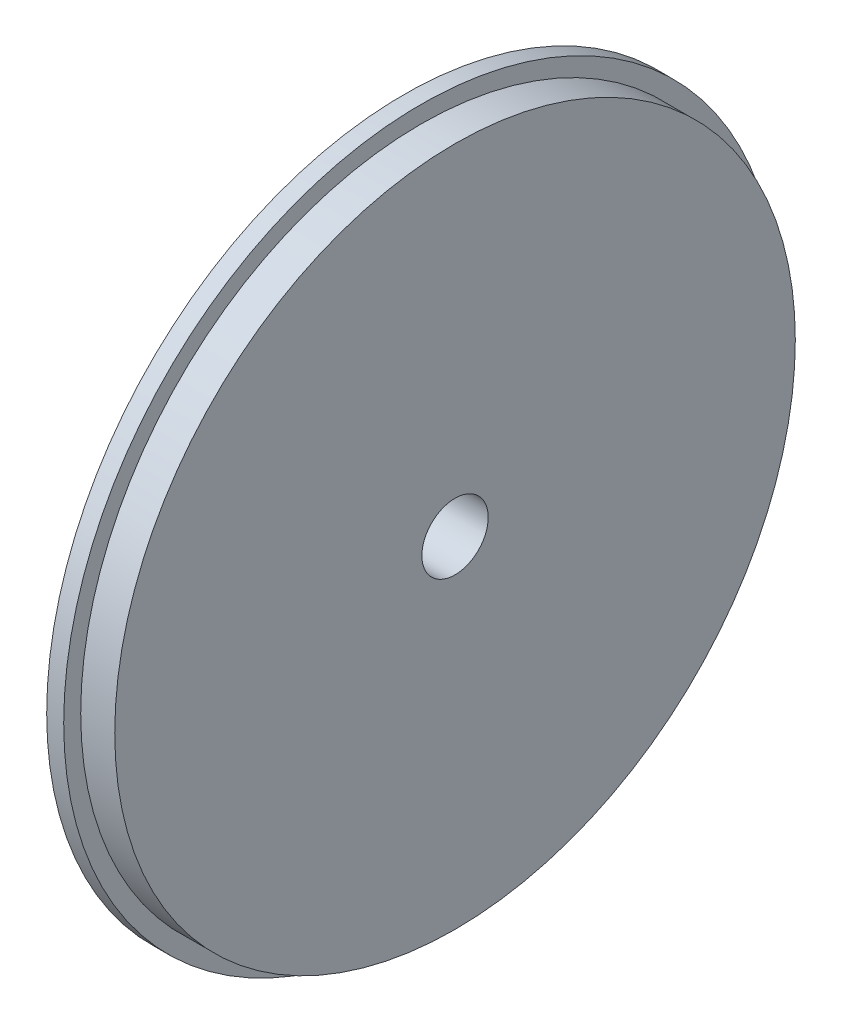
ISO-10303-21;
HEADER;
FILE_DESCRIPTION(('STEP AP214'),'2;1');
FILE_NAME('part.step','',(''),(''),'','','');
FILE_SCHEMA(('AUTOMOTIVE_DESIGN { 1 0 10303 214 1 1 1 1 }'));
ENDSEC;
DATA;
#1=APPLICATION_CONTEXT('core data for automotive mechanical design processes');
#2=APPLICATION_PROTOCOL_DEFINITION('international standard','automotive_design',2000,#1);
#3=PRODUCT_CONTEXT('',#1,'mechanical');
#4=PRODUCT('Part','Part','',(#3));
#5=PRODUCT_RELATED_PRODUCT_CATEGORY('part','',(#4));
#6=PRODUCT_DEFINITION_FORMATION('','',#4);
#7=PRODUCT_DEFINITION_CONTEXT('part definition',#1,'design');
#8=PRODUCT_DEFINITION('design','',#6,#7);
#9=PRODUCT_DEFINITION_SHAPE('','',#8);
#10=(LENGTH_UNIT() NAMED_UNIT(*) SI_UNIT(.MILLI.,.METRE.));
#11=(NAMED_UNIT(*) PLANE_ANGLE_UNIT() SI_UNIT($,.RADIAN.));
#12=(NAMED_UNIT(*) SI_UNIT($,.STERADIAN.) SOLID_ANGLE_UNIT());
#13=UNCERTAINTY_MEASURE_WITH_UNIT(LENGTH_MEASURE(1.E-05),#10,'distance_accuracy_value','');
#14=(GEOMETRIC_REPRESENTATION_CONTEXT(3) GLOBAL_UNCERTAINTY_ASSIGNED_CONTEXT((#13)) GLOBAL_UNIT_ASSIGNED_CONTEXT((#10,
#11,#12)) REPRESENTATION_CONTEXT('',''));
#15=CARTESIAN_POINT('',(0.,0.,0.));
#16=DIRECTION('',(0.,0.,1.));
#17=DIRECTION('',(1.,0.,0.));
#18=AXIS2_PLACEMENT_3D('',#15,#16,#17);
#19=CARTESIAN_POINT('',(-0.75,0.975,0.));
#20=DIRECTION('',(1.,0.,0.));
#21=DIRECTION('',(0.,0.,-1.));
#22=AXIS2_PLACEMENT_3D('',#19,#20,#21);
#23=PLANE('',#22);
#24=CARTESIAN_POINT('',(-0.75,0.,0.));
#25=DIRECTION('',(-1.,0.,0.));
#26=DIRECTION('',(0.,0.,1.));
#27=AXIS2_PLACEMENT_3D('',#24,#25,#26);
#28=CIRCLE('',#27,0.975);
#29=CARTESIAN_POINT('',(-0.75,0.,0.975));
#30=VERTEX_POINT('',#29);
#31=EDGE_CURVE('E54',#30,#30,#28,.T.);
#32=ORIENTED_EDGE('',*,*,#31,.F.);
#33=EDGE_LOOP('',(#32));
#34=FACE_BOUND('',#33,.T.);
#35=CARTESIAN_POINT('',(-0.750000000000001,0.,0.));
#36=DIRECTION('',(-1.,0.,0.));
#37=DIRECTION('',(0.,0.,1.));
#38=AXIS2_PLACEMENT_3D('',#35,#36,#37);
#39=CIRCLE('',#38,10.5);
#40=CARTESIAN_POINT('',(-0.750000000000001,0.,10.5));
#41=VERTEX_POINT('',#40);
#42=EDGE_CURVE('E10',#41,#41,#39,.T.);
#43=ORIENTED_EDGE('',*,*,#42,.T.);
#44=EDGE_LOOP('',(#43));
#45=FACE_BOUND('',#44,.T.);
#46=ADVANCED_FACE('F32',(#34,#45),#23,.F.);
#47=CARTESIAN_POINT('',(-0.75,0.,0.));
#48=DIRECTION('',(-1.,0.,0.));
#49=DIRECTION('',(0.,0.,1.));
#50=AXIS2_PLACEMENT_3D('',#47,#48,#49);
#51=CYLINDRICAL_SURFACE('',#50,10.5);
#52=ORIENTED_EDGE('',*,*,#42,.F.);
#53=EDGE_LOOP('',(#52));
#54=FACE_BOUND('',#53,.T.);
#55=CARTESIAN_POINT('',(-0.25,0.,0.));
#56=DIRECTION('',(-1.,0.,0.));
#57=DIRECTION('',(0.,0.,1.));
#58=AXIS2_PLACEMENT_3D('',#55,#56,#57);
#59=CIRCLE('',#58,10.5);
#60=CARTESIAN_POINT('',(-0.25,0.,10.5));
#61=VERTEX_POINT('',#60);
#62=EDGE_CURVE('E38',#61,#61,#59,.T.);
#63=ORIENTED_EDGE('',*,*,#62,.T.);
#64=EDGE_LOOP('',(#63));
#65=FACE_BOUND('',#64,.T.);
#66=ADVANCED_FACE('F61',(#54,#65),#51,.T.);
#67=CARTESIAN_POINT('',(-0.25,10.5,0.));
#68=DIRECTION('',(-1.,0.,0.));
#69=DIRECTION('',(0.,0.,1.));
#70=AXIS2_PLACEMENT_3D('',#67,#68,#69);
#71=PLANE('',#70);
#72=ORIENTED_EDGE('',*,*,#62,.F.);
#73=EDGE_LOOP('',(#72));
#74=FACE_BOUND('',#73,.T.);
#75=CARTESIAN_POINT('',(-0.25,0.,0.));
#76=DIRECTION('',(-1.,0.,0.));
#77=DIRECTION('',(0.,0.,1.));
#78=AXIS2_PLACEMENT_3D('',#75,#76,#77);
#79=CIRCLE('',#78,10.);
#80=CARTESIAN_POINT('',(-0.25,0.,10.));
#81=VERTEX_POINT('',#80);
#82=EDGE_CURVE('E42',#81,#81,#79,.T.);
#83=ORIENTED_EDGE('',*,*,#82,.T.);
#84=EDGE_LOOP('',(#83));
#85=FACE_BOUND('',#84,.T.);
#86=ADVANCED_FACE('F65',(#74,#85),#71,.F.);
#87=CARTESIAN_POINT('',(-0.75,0.,0.));
#88=DIRECTION('',(-1.,0.,0.));
#89=DIRECTION('',(0.,0.,1.));
#90=AXIS2_PLACEMENT_3D('',#87,#88,#89);
#91=CYLINDRICAL_SURFACE('',#90,10.);
#92=ORIENTED_EDGE('',*,*,#82,.F.);
#93=EDGE_LOOP('',(#92));
#94=FACE_BOUND('',#93,.T.);
#95=CARTESIAN_POINT('',(0.750000000000002,0.,0.));
#96=DIRECTION('',(-1.,0.,0.));
#97=DIRECTION('',(0.,0.,1.));
#98=AXIS2_PLACEMENT_3D('',#95,#96,#97);
#99=CIRCLE('',#98,10.);
#100=CARTESIAN_POINT('',(0.750000000000002,0.,10.));
#101=VERTEX_POINT('',#100);
#102=EDGE_CURVE('E46',#101,#101,#99,.T.);
#103=ORIENTED_EDGE('',*,*,#102,.T.);
#104=EDGE_LOOP('',(#103));
#105=FACE_BOUND('',#104,.T.);
#106=ADVANCED_FACE('F70',(#94,#105),#91,.T.);
#107=CARTESIAN_POINT('',(0.750000000000001,0.975,0.));
#108=DIRECTION('',(-1.,0.,0.));
#109=DIRECTION('',(0.,0.,1.));
#110=AXIS2_PLACEMENT_3D('',#107,#108,#109);
#111=PLANE('',#110);
#112=ORIENTED_EDGE('',*,*,#102,.F.);
#113=EDGE_LOOP('',(#112));
#114=FACE_BOUND('',#113,.T.);
#115=CARTESIAN_POINT('',(0.75,0.,0.));
#116=DIRECTION('',(-1.,0.,0.));
#117=DIRECTION('',(0.,0.,1.));
#118=AXIS2_PLACEMENT_3D('',#115,#116,#117);
#119=CIRCLE('',#118,0.975);
#120=CARTESIAN_POINT('',(0.75,0.,0.975));
#121=VERTEX_POINT('',#120);
#122=EDGE_CURVE('E51',#121,#121,#119,.T.);
#123=ORIENTED_EDGE('',*,*,#122,.T.);
#124=EDGE_LOOP('',(#123));
#125=FACE_BOUND('',#124,.T.);
#126=ADVANCED_FACE('F76',(#114,#125),#111,.F.);
#127=CARTESIAN_POINT('',(-0.75,0.,0.));
#128=DIRECTION('',(-1.,0.,0.));
#129=DIRECTION('',(0.,0.,1.));
#130=AXIS2_PLACEMENT_3D('',#127,#128,#129);
#131=CYLINDRICAL_SURFACE('',#130,0.975);
#132=ORIENTED_EDGE('',*,*,#122,.F.);
#133=EDGE_LOOP('',(#132));
#134=FACE_BOUND('',#133,.T.);
#135=ORIENTED_EDGE('',*,*,#31,.T.);
#136=EDGE_LOOP('',(#135));
#137=FACE_BOUND('',#136,.T.);
#138=ADVANCED_FACE('F58',(#134,#137),#131,.F.);
#139=CLOSED_SHELL('',(#46,#66,#86,#106,#126,#138));
#140=MANIFOLD_SOLID_BREP('B2',#139);
#141=ADVANCED_BREP_SHAPE_REPRESENTATION('',(#18,#140),#14);
#142=SHAPE_DEFINITION_REPRESENTATION(#9,#141);
ENDSEC;
END-ISO-10303-21;
